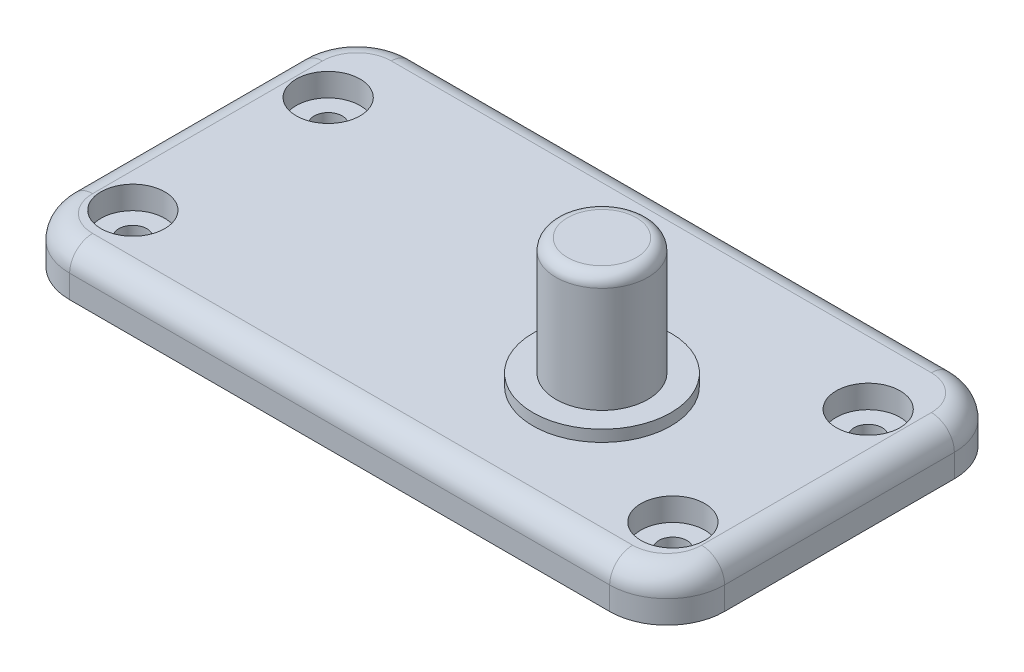
ISO-10303-21;
HEADER;
FILE_DESCRIPTION(('STEP AP214'),'2;1');
FILE_NAME('part.step','',(''),(''),'','','');
FILE_SCHEMA(('AUTOMOTIVE_DESIGN { 1 0 10303 214 1 1 1 1 }'));
ENDSEC;
DATA;
#1=APPLICATION_CONTEXT('core data for automotive mechanical design processes');
#2=APPLICATION_PROTOCOL_DEFINITION('international standard','automotive_design',2000,#1);
#3=PRODUCT_CONTEXT('',#1,'mechanical');
#4=PRODUCT('Part','Part','',(#3));
#5=PRODUCT_RELATED_PRODUCT_CATEGORY('part','',(#4));
#6=PRODUCT_DEFINITION_FORMATION('','',#4);
#7=PRODUCT_DEFINITION_CONTEXT('part definition',#1,'design');
#8=PRODUCT_DEFINITION('design','',#6,#7);
#9=PRODUCT_DEFINITION_SHAPE('','',#8);
#10=(LENGTH_UNIT() NAMED_UNIT(*) SI_UNIT(.MILLI.,.METRE.));
#11=(NAMED_UNIT(*) PLANE_ANGLE_UNIT() SI_UNIT($,.RADIAN.));
#12=(NAMED_UNIT(*) SI_UNIT($,.STERADIAN.) SOLID_ANGLE_UNIT());
#13=UNCERTAINTY_MEASURE_WITH_UNIT(LENGTH_MEASURE(1.E-05),#10,'distance_accuracy_value','');
#14=(GEOMETRIC_REPRESENTATION_CONTEXT(3) GLOBAL_UNCERTAINTY_ASSIGNED_CONTEXT((#13)) GLOBAL_UNIT_ASSIGNED_CONTEXT((#10,
#11,#12)) REPRESENTATION_CONTEXT('',''));
#15=CARTESIAN_POINT('',(0.,0.,0.));
#16=DIRECTION('',(0.,0.,1.));
#17=DIRECTION('',(1.,0.,0.));
#18=AXIS2_PLACEMENT_3D('',#15,#16,#17);
#19=CARTESIAN_POINT('',(-28.5,4.,15.));
#20=DIRECTION('',(1.,0.,0.));
#21=DIRECTION('',(0.,0.,-1.));
#22=AXIS2_PLACEMENT_3D('',#19,#20,#21);
#23=PLANE('',#22);
#24=DIRECTION('',(0.,-1.,0.));
#25=VECTOR('',#24,1.);
#26=CARTESIAN_POINT('',(-28.5,4.,10.));
#27=LINE('',#26,#25);
#28=CARTESIAN_POINT('',(-28.5,0.,10.));
#29=VERTEX_POINT('',#28);
#30=CARTESIAN_POINT('',(-28.5,2.,10.));
#31=VERTEX_POINT('',#30);
#32=EDGE_CURVE('E171',#29,#31,#27,.F.);
#33=ORIENTED_EDGE('',*,*,#32,.T.);
#34=DIRECTION('',(0.,0.,1.));
#35=VECTOR('',#34,1.);
#36=CARTESIAN_POINT('',(-28.5,2.,15.));
#37=LINE('',#36,#35);
#38=CARTESIAN_POINT('',(-28.5,2.,-10.));
#39=VERTEX_POINT('',#38);
#40=EDGE_CURVE('E200',#31,#39,#37,.F.);
#41=ORIENTED_EDGE('',*,*,#40,.T.);
#42=DIRECTION('',(0.,-1.,0.));
#43=VECTOR('',#42,1.);
#44=CARTESIAN_POINT('',(-28.5,4.,-10.));
#45=LINE('',#44,#43);
#46=CARTESIAN_POINT('',(-28.5,0.,-10.));
#47=VERTEX_POINT('',#46);
#48=EDGE_CURVE('E174',#39,#47,#45,.T.);
#49=ORIENTED_EDGE('',*,*,#48,.T.);
#50=DIRECTION('',(0.,0.,1.));
#51=VECTOR('',#50,1.);
#52=CARTESIAN_POINT('',(-28.5,0.,15.));
#53=LINE('',#52,#51);
#54=EDGE_CURVE('E157',#47,#29,#53,.T.);
#55=ORIENTED_EDGE('',*,*,#54,.T.);
#56=EDGE_LOOP('',(#33,#41,#49,#55));
#57=FACE_BOUND('',#56,.T.);
#58=ADVANCED_FACE('F34',(#57),#23,.F.);
#59=CARTESIAN_POINT('',(-28.5,4.,15.));
#60=DIRECTION('',(0.,0.,-1.));
#61=DIRECTION('',(-1.,0.,0.));
#62=AXIS2_PLACEMENT_3D('',#59,#60,#61);
#63=PLANE('',#62);
#64=DIRECTION('',(0.,-1.,0.));
#65=VECTOR('',#64,1.);
#66=CARTESIAN_POINT('',(23.5,4.,15.));
#67=LINE('',#66,#65);
#68=CARTESIAN_POINT('',(23.5,0.,15.));
#69=VERTEX_POINT('',#68);
#70=CARTESIAN_POINT('',(23.5,2.,15.));
#71=VERTEX_POINT('',#70);
#72=EDGE_CURVE('E168',#69,#71,#67,.F.);
#73=ORIENTED_EDGE('',*,*,#72,.T.);
#74=DIRECTION('',(1.,0.,0.));
#75=VECTOR('',#74,1.);
#76=CARTESIAN_POINT('',(-28.5,2.,15.));
#77=LINE('',#76,#75);
#78=CARTESIAN_POINT('',(-23.5,2.,15.));
#79=VERTEX_POINT('',#78);
#80=EDGE_CURVE('E196',#71,#79,#77,.F.);
#81=ORIENTED_EDGE('',*,*,#80,.T.);
#82=DIRECTION('',(0.,-1.,0.));
#83=VECTOR('',#82,1.);
#84=CARTESIAN_POINT('',(-23.5,4.,15.));
#85=LINE('',#84,#83);
#86=CARTESIAN_POINT('',(-23.5,0.,15.));
#87=VERTEX_POINT('',#86);
#88=EDGE_CURVE('E166',#79,#87,#85,.T.);
#89=ORIENTED_EDGE('',*,*,#88,.T.);
#90=DIRECTION('',(1.,0.,0.));
#91=VECTOR('',#90,1.);
#92=CARTESIAN_POINT('',(-28.5,0.,15.));
#93=LINE('',#92,#91);
#94=EDGE_CURVE('E151',#87,#69,#93,.T.);
#95=ORIENTED_EDGE('',*,*,#94,.T.);
#96=EDGE_LOOP('',(#73,#81,#89,#95));
#97=FACE_BOUND('',#96,.T.);
#98=ADVANCED_FACE('F246',(#97),#63,.F.);
#99=CARTESIAN_POINT('',(28.5,4.,15.));
#100=DIRECTION('',(-1.,0.,0.));
#101=DIRECTION('',(0.,0.,1.));
#102=AXIS2_PLACEMENT_3D('',#99,#100,#101);
#103=PLANE('',#102);
#104=DIRECTION('',(0.,-1.,0.));
#105=VECTOR('',#104,1.);
#106=CARTESIAN_POINT('',(28.5,4.,-10.));
#107=LINE('',#106,#105);
#108=CARTESIAN_POINT('',(28.5,0.,-10.));
#109=VERTEX_POINT('',#108);
#110=CARTESIAN_POINT('',(28.5,2.,-10.));
#111=VERTEX_POINT('',#110);
#112=EDGE_CURVE('E135',#109,#111,#107,.F.);
#113=ORIENTED_EDGE('',*,*,#112,.T.);
#114=DIRECTION('',(0.,0.,-1.));
#115=VECTOR('',#114,1.);
#116=CARTESIAN_POINT('',(28.5,2.,15.));
#117=LINE('',#116,#115);
#118=CARTESIAN_POINT('',(28.5,2.,10.));
#119=VERTEX_POINT('',#118);
#120=EDGE_CURVE('E206',#111,#119,#117,.F.);
#121=ORIENTED_EDGE('',*,*,#120,.T.);
#122=DIRECTION('',(0.,-1.,0.));
#123=VECTOR('',#122,1.);
#124=CARTESIAN_POINT('',(28.5,4.,10.));
#125=LINE('',#124,#123);
#126=CARTESIAN_POINT('',(28.5,0.,10.));
#127=VERTEX_POINT('',#126);
#128=EDGE_CURVE('E139',#119,#127,#125,.T.);
#129=ORIENTED_EDGE('',*,*,#128,.T.);
#130=DIRECTION('',(0.,0.,-1.));
#131=VECTOR('',#130,1.);
#132=CARTESIAN_POINT('',(28.5,0.,15.));
#133=LINE('',#132,#131);
#134=EDGE_CURVE('E147',#127,#109,#133,.T.);
#135=ORIENTED_EDGE('',*,*,#134,.T.);
#136=EDGE_LOOP('',(#113,#121,#129,#135));
#137=FACE_BOUND('',#136,.T.);
#138=ADVANCED_FACE('F252',(#137),#103,.F.);
#139=CARTESIAN_POINT('',(-28.5,4.,-15.));
#140=DIRECTION('',(0.,0.,1.));
#141=DIRECTION('',(1.,0.,0.));
#142=AXIS2_PLACEMENT_3D('',#139,#140,#141);
#143=PLANE('',#142);
#144=DIRECTION('',(0.,-1.,0.));
#145=VECTOR('',#144,1.);
#146=CARTESIAN_POINT('',(-23.5,4.,-15.));
#147=LINE('',#146,#145);
#148=CARTESIAN_POINT('',(-23.5,0.,-15.));
#149=VERTEX_POINT('',#148);
#150=CARTESIAN_POINT('',(-23.5,2.,-15.));
#151=VERTEX_POINT('',#150);
#152=EDGE_CURVE('E131',#149,#151,#147,.F.);
#153=ORIENTED_EDGE('',*,*,#152,.T.);
#154=DIRECTION('',(-1.,0.,0.));
#155=VECTOR('',#154,1.);
#156=CARTESIAN_POINT('',(-28.5,2.,-15.));
#157=LINE('',#156,#155);
#158=CARTESIAN_POINT('',(23.5,2.,-15.));
#159=VERTEX_POINT('',#158);
#160=EDGE_CURVE('E57',#151,#159,#157,.F.);
#161=ORIENTED_EDGE('',*,*,#160,.T.);
#162=DIRECTION('',(0.,-1.,0.));
#163=VECTOR('',#162,1.);
#164=CARTESIAN_POINT('',(23.5,4.,-15.));
#165=LINE('',#164,#163);
#166=CARTESIAN_POINT('',(23.5,0.,-15.));
#167=VERTEX_POINT('',#166);
#168=EDGE_CURVE('E123',#159,#167,#165,.T.);
#169=ORIENTED_EDGE('',*,*,#168,.T.);
#170=DIRECTION('',(-1.,0.,0.));
#171=VECTOR('',#170,1.);
#172=CARTESIAN_POINT('',(-28.5,0.,-15.));
#173=LINE('',#172,#171);
#174=EDGE_CURVE('E127',#167,#149,#173,.T.);
#175=ORIENTED_EDGE('',*,*,#174,.T.);
#176=EDGE_LOOP('',(#153,#161,#169,#175));
#177=FACE_BOUND('',#176,.T.);
#178=ADVANCED_FACE('F125',(#177),#143,.F.);
#179=CARTESIAN_POINT('',(0.,4.,0.));
#180=DIRECTION('',(0.,-1.,0.));
#181=DIRECTION('',(0.,0.,-1.));
#182=AXIS2_PLACEMENT_3D('',#179,#180,#181);
#183=PLANE('',#182);
#184=DIRECTION('',(1.,0.,0.));
#185=VECTOR('',#184,1.);
#186=CARTESIAN_POINT('',(0.,4.,13.));
#187=LINE('',#186,#185);
#188=CARTESIAN_POINT('',(-23.5,4.,13.));
#189=VERTEX_POINT('',#188);
#190=CARTESIAN_POINT('',(23.5,4.,13.));
#191=VERTEX_POINT('',#190);
#192=EDGE_CURVE('E188',#189,#191,#187,.T.);
#193=ORIENTED_EDGE('',*,*,#192,.T.);
#194=CARTESIAN_POINT('',(23.5,4.,10.));
#195=DIRECTION('',(0.,-1.,0.));
#196=DIRECTION('',(0.,0.,-1.));
#197=AXIS2_PLACEMENT_3D('',#194,#195,#196);
#198=CIRCLE('',#197,3.);
#199=CARTESIAN_POINT('',(26.5,4.,10.));
#200=VERTEX_POINT('',#199);
#201=EDGE_CURVE('E190',#191,#200,#198,.F.);
#202=ORIENTED_EDGE('',*,*,#201,.T.);
#203=DIRECTION('',(0.,0.,-1.));
#204=VECTOR('',#203,1.);
#205=CARTESIAN_POINT('',(26.5,4.,0.));
#206=LINE('',#205,#204);
#207=CARTESIAN_POINT('',(26.5,4.,-10.));
#208=VERTEX_POINT('',#207);
#209=EDGE_CURVE('E176',#200,#208,#206,.T.);
#210=ORIENTED_EDGE('',*,*,#209,.T.);
#211=CARTESIAN_POINT('',(23.5,4.,-10.));
#212=DIRECTION('',(0.,-1.,0.));
#213=DIRECTION('',(0.,0.,-1.));
#214=AXIS2_PLACEMENT_3D('',#211,#212,#213);
#215=CIRCLE('',#214,3.);
#216=CARTESIAN_POINT('',(23.5,4.,-13.));
#217=VERTEX_POINT('',#216);
#218=EDGE_CURVE('E178',#208,#217,#215,.F.);
#219=ORIENTED_EDGE('',*,*,#218,.T.);
#220=DIRECTION('',(-1.,0.,0.));
#221=VECTOR('',#220,1.);
#222=CARTESIAN_POINT('',(0.,4.,-13.));
#223=LINE('',#222,#221);
#224=CARTESIAN_POINT('',(-23.5,4.,-13.));
#225=VERTEX_POINT('',#224);
#226=EDGE_CURVE('E180',#217,#225,#223,.T.);
#227=ORIENTED_EDGE('',*,*,#226,.T.);
#228=CARTESIAN_POINT('',(-23.5,4.,-10.));
#229=DIRECTION('',(0.,-1.,0.));
#230=DIRECTION('',(0.,0.,-1.));
#231=AXIS2_PLACEMENT_3D('',#228,#229,#230);
#232=CIRCLE('',#231,3.);
#233=CARTESIAN_POINT('',(-26.5,4.,-10.));
#234=VERTEX_POINT('',#233);
#235=EDGE_CURVE('E182',#225,#234,#232,.F.);
#236=ORIENTED_EDGE('',*,*,#235,.T.);
#237=DIRECTION('',(0.,0.,1.));
#238=VECTOR('',#237,1.);
#239=CARTESIAN_POINT('',(-26.5,4.,0.));
#240=LINE('',#239,#238);
#241=CARTESIAN_POINT('',(-26.5,4.,10.));
#242=VERTEX_POINT('',#241);
#243=EDGE_CURVE('E184',#234,#242,#240,.T.);
#244=ORIENTED_EDGE('',*,*,#243,.T.);
#245=CARTESIAN_POINT('',(-23.5,4.,10.));
#246=DIRECTION('',(0.,-1.,0.));
#247=DIRECTION('',(0.,0.,-1.));
#248=AXIS2_PLACEMENT_3D('',#245,#246,#247);
#249=CIRCLE('',#248,3.);
#250=EDGE_CURVE('E186',#242,#189,#249,.F.);
#251=ORIENTED_EDGE('',*,*,#250,.T.);
#252=EDGE_LOOP('',(#193,#202,#210,#219,#227,#236,#244,#251));
#253=FACE_BOUND('',#252,.T.);
#254=CARTESIAN_POINT('',(-23.5,4.,-7.5));
#255=DIRECTION('',(0.,1.,0.));
#256=DIRECTION('',(0.,0.,1.));
#257=AXIS2_PLACEMENT_3D('',#254,#255,#256);
#258=CIRCLE('',#257,2.77875999999999);
#259=CARTESIAN_POINT('',(-23.5,4.,-4.72124000000001));
#260=VERTEX_POINT('',#259);
#261=EDGE_CURVE('E229',#260,#260,#258,.T.);
#262=ORIENTED_EDGE('',*,*,#261,.F.);
#263=EDGE_LOOP('',(#262));
#264=FACE_BOUND('',#263,.T.);
#265=CARTESIAN_POINT('',(-23.5,4.,9.5));
#266=DIRECTION('',(0.,1.,0.));
#267=DIRECTION('',(0.,0.,1.));
#268=AXIS2_PLACEMENT_3D('',#265,#266,#267);
#269=CIRCLE('',#268,2.77875999999999);
#270=CARTESIAN_POINT('',(-23.5,4.,12.27876));
#271=VERTEX_POINT('',#270);
#272=EDGE_CURVE('E368',#271,#271,#269,.T.);
#273=ORIENTED_EDGE('',*,*,#272,.F.);
#274=EDGE_LOOP('',(#273));
#275=FACE_BOUND('',#274,.T.);
#276=CARTESIAN_POINT('',(23.5,4.,9.5));
#277=DIRECTION('',(0.,1.,0.));
#278=DIRECTION('',(0.,0.,1.));
#279=AXIS2_PLACEMENT_3D('',#276,#277,#278);
#280=CIRCLE('',#279,2.77875999999999);
#281=CARTESIAN_POINT('',(23.5,4.,12.27876));
#282=VERTEX_POINT('',#281);
#283=EDGE_CURVE('E356',#282,#282,#280,.T.);
#284=ORIENTED_EDGE('',*,*,#283,.F.);
#285=EDGE_LOOP('',(#284));
#286=FACE_BOUND('',#285,.T.);
#287=CARTESIAN_POINT('',(23.5,4.,-7.5));
#288=DIRECTION('',(0.,1.,0.));
#289=DIRECTION('',(0.,0.,1.));
#290=AXIS2_PLACEMENT_3D('',#287,#288,#289);
#291=CIRCLE('',#290,2.77875999999999);
#292=CARTESIAN_POINT('',(23.5,4.,-4.72124000000001));
#293=VERTEX_POINT('',#292);
#294=EDGE_CURVE('E344',#293,#293,#291,.T.);
#295=ORIENTED_EDGE('',*,*,#294,.F.);
#296=EDGE_LOOP('',(#295));
#297=FACE_BOUND('',#296,.T.);
#298=CARTESIAN_POINT('',(10.18,4.,2.35));
#299=DIRECTION('',(0.,-1.,0.));
#300=DIRECTION('',(0.,0.,-1.));
#301=AXIS2_PLACEMENT_3D('',#298,#299,#300);
#302=CIRCLE('',#301,6.);
#303=CARTESIAN_POINT('',(10.18,4.,-3.65));
#304=VERTEX_POINT('',#303);
#305=EDGE_CURVE('E146',#304,#304,#302,.F.);
#306=ORIENTED_EDGE('',*,*,#305,.F.);
#307=EDGE_LOOP('',(#306));
#308=FACE_BOUND('',#307,.T.);
#309=ADVANCED_FACE('F384',(#253,#264,#275,#286,#297,#308),#183,.F.);
#310=CARTESIAN_POINT('',(0.,0.,0.));
#311=DIRECTION('',(0.,-1.,0.));
#312=DIRECTION('',(0.,0.,-1.));
#313=AXIS2_PLACEMENT_3D('',#310,#311,#312);
#314=PLANE('',#313);
#315=CARTESIAN_POINT('',(-23.5,0.,-7.5));
#316=DIRECTION('',(0.,1.,0.));
#317=DIRECTION('',(0.,0.,1.));
#318=AXIS2_PLACEMENT_3D('',#315,#316,#317);
#319=CIRCLE('',#318,1.2192);
#320=CARTESIAN_POINT('',(-23.5,0.,-6.2808));
#321=VERTEX_POINT('',#320);
#322=EDGE_CURVE('E371',#321,#321,#319,.T.);
#323=ORIENTED_EDGE('',*,*,#322,.T.);
#324=EDGE_LOOP('',(#323));
#325=FACE_BOUND('',#324,.T.);
#326=CARTESIAN_POINT('',(-23.5,0.,9.5));
#327=DIRECTION('',(0.,1.,0.));
#328=DIRECTION('',(0.,0.,1.));
#329=AXIS2_PLACEMENT_3D('',#326,#327,#328);
#330=CIRCLE('',#329,1.2192);
#331=CARTESIAN_POINT('',(-23.5,0.,10.7192));
#332=VERTEX_POINT('',#331);
#333=EDGE_CURVE('E359',#332,#332,#330,.T.);
#334=ORIENTED_EDGE('',*,*,#333,.T.);
#335=EDGE_LOOP('',(#334));
#336=FACE_BOUND('',#335,.T.);
#337=CARTESIAN_POINT('',(23.5,0.,9.5));
#338=DIRECTION('',(0.,1.,0.));
#339=DIRECTION('',(0.,0.,1.));
#340=AXIS2_PLACEMENT_3D('',#337,#338,#339);
#341=CIRCLE('',#340,1.2192);
#342=CARTESIAN_POINT('',(23.5,0.,10.7192));
#343=VERTEX_POINT('',#342);
#344=EDGE_CURVE('E347',#343,#343,#341,.T.);
#345=ORIENTED_EDGE('',*,*,#344,.T.);
#346=EDGE_LOOP('',(#345));
#347=FACE_BOUND('',#346,.T.);
#348=CARTESIAN_POINT('',(23.5,0.,-7.5));
#349=DIRECTION('',(0.,1.,0.));
#350=DIRECTION('',(0.,0.,1.));
#351=AXIS2_PLACEMENT_3D('',#348,#349,#350);
#352=CIRCLE('',#351,1.2192);
#353=CARTESIAN_POINT('',(23.5,0.,-6.2808));
#354=VERTEX_POINT('',#353);
#355=EDGE_CURVE('E335',#354,#354,#352,.T.);
#356=ORIENTED_EDGE('',*,*,#355,.T.);
#357=EDGE_LOOP('',(#356));
#358=FACE_BOUND('',#357,.T.);
#359=ORIENTED_EDGE('',*,*,#174,.F.);
#360=CARTESIAN_POINT('',(23.5,0.,-10.));
#361=DIRECTION('',(0.,-1.,0.));
#362=DIRECTION('',(0.,0.,-1.));
#363=AXIS2_PLACEMENT_3D('',#360,#361,#362);
#364=CIRCLE('',#363,5.);
#365=EDGE_CURVE('E133',#167,#109,#364,.T.);
#366=ORIENTED_EDGE('',*,*,#365,.T.);
#367=ORIENTED_EDGE('',*,*,#134,.F.);
#368=CARTESIAN_POINT('',(23.5,0.,10.));
#369=DIRECTION('',(0.,-1.,0.));
#370=DIRECTION('',(0.,0.,-1.));
#371=AXIS2_PLACEMENT_3D('',#368,#369,#370);
#372=CIRCLE('',#371,5.);
#373=EDGE_CURVE('E140',#127,#69,#372,.T.);
#374=ORIENTED_EDGE('',*,*,#373,.T.);
#375=ORIENTED_EDGE('',*,*,#94,.F.);
#376=CARTESIAN_POINT('',(-23.5,0.,10.));
#377=DIRECTION('',(0.,-1.,0.));
#378=DIRECTION('',(0.,0.,-1.));
#379=AXIS2_PLACEMENT_3D('',#376,#377,#378);
#380=CIRCLE('',#379,5.);
#381=EDGE_CURVE('E130',#87,#29,#380,.T.);
#382=ORIENTED_EDGE('',*,*,#381,.T.);
#383=ORIENTED_EDGE('',*,*,#54,.F.);
#384=CARTESIAN_POINT('',(-23.5,0.,-10.));
#385=DIRECTION('',(0.,-1.,0.));
#386=DIRECTION('',(0.,0.,-1.));
#387=AXIS2_PLACEMENT_3D('',#384,#385,#386);
#388=CIRCLE('',#387,5.);
#389=EDGE_CURVE('E145',#47,#149,#388,.T.);
#390=ORIENTED_EDGE('',*,*,#389,.T.);
#391=EDGE_LOOP('',(#359,#366,#367,#374,#375,#382,#383,#390));
#392=FACE_BOUND('',#391,.T.);
#393=ADVANCED_FACE('F142',(#325,#336,#347,#358,#392),#314,.T.);
#394=CARTESIAN_POINT('',(10.18,5.,2.35));
#395=DIRECTION('',(0.,-1.,0.));
#396=DIRECTION('',(0.,0.,-1.));
#397=AXIS2_PLACEMENT_3D('',#394,#395,#396);
#398=CYLINDRICAL_SURFACE('',#397,6.);
#399=CARTESIAN_POINT('',(10.18,5.,2.35));
#400=DIRECTION('',(0.,1.,0.));
#401=DIRECTION('',(0.,0.,1.));
#402=AXIS2_PLACEMENT_3D('',#399,#400,#401);
#403=CIRCLE('',#402,6.);
#404=CARTESIAN_POINT('',(10.18,5.,8.35));
#405=VERTEX_POINT('',#404);
#406=EDGE_CURVE('E158',#405,#405,#403,.T.);
#407=ORIENTED_EDGE('',*,*,#406,.F.);
#408=EDGE_LOOP('',(#407));
#409=FACE_BOUND('',#408,.T.);
#410=ORIENTED_EDGE('',*,*,#305,.T.);
#411=EDGE_LOOP('',(#410));
#412=FACE_BOUND('',#411,.T.);
#413=ADVANCED_FACE('F397',(#409,#412),#398,.T.);
#414=CARTESIAN_POINT('',(10.18,5.,2.35));
#415=DIRECTION('',(0.,1.,0.));
#416=DIRECTION('',(0.,0.,1.));
#417=AXIS2_PLACEMENT_3D('',#414,#415,#416);
#418=PLANE('',#417);
#419=CARTESIAN_POINT('',(10.18,5.,2.35));
#420=DIRECTION('',(0.,1.,0.));
#421=DIRECTION('',(0.,0.,1.));
#422=AXIS2_PLACEMENT_3D('',#419,#420,#421);
#423=CIRCLE('',#422,3.99999999999999);
#424=CARTESIAN_POINT('',(10.18,5.,6.34999999999999));
#425=VERTEX_POINT('',#424);
#426=EDGE_CURVE('E155',#425,#425,#423,.T.);
#427=ORIENTED_EDGE('',*,*,#426,.F.);
#428=EDGE_LOOP('',(#427));
#429=FACE_BOUND('',#428,.T.);
#430=ORIENTED_EDGE('',*,*,#406,.T.);
#431=EDGE_LOOP('',(#430));
#432=FACE_BOUND('',#431,.T.);
#433=ADVANCED_FACE('F399',(#429,#432),#418,.T.);
#434=CARTESIAN_POINT('',(10.18,15.2,2.35));
#435=DIRECTION('',(0.,1.,0.));
#436=DIRECTION('',(0.,0.,1.));
#437=AXIS2_PLACEMENT_3D('',#434,#435,#436);
#438=PLANE('',#437);
#439=CARTESIAN_POINT('',(10.18,15.2,2.35));
#440=DIRECTION('',(0.,1.,0.));
#441=DIRECTION('',(0.,0.,1.));
#442=AXIS2_PLACEMENT_3D('',#439,#440,#441);
#443=CIRCLE('',#442,2.99999999999999);
#444=CARTESIAN_POINT('',(10.18,15.2,5.35));
#445=VERTEX_POINT('',#444);
#446=EDGE_CURVE('E42',#445,#445,#443,.T.);
#447=ORIENTED_EDGE('',*,*,#446,.T.);
#448=EDGE_LOOP('',(#447));
#449=FACE_BOUND('',#448,.T.);
#450=ADVANCED_FACE('F233',(#449),#438,.T.);
#451=CARTESIAN_POINT('',(10.18,15.2,2.35));
#452=DIRECTION('',(0.,-1.,0.));
#453=DIRECTION('',(0.,0.,-1.));
#454=AXIS2_PLACEMENT_3D('',#451,#452,#453);
#455=CYLINDRICAL_SURFACE('',#454,3.99999999999999);
#456=CARTESIAN_POINT('',(10.18,14.2,2.35));
#457=DIRECTION('',(0.,1.,0.));
#458=DIRECTION('',(0.,0.,1.));
#459=AXIS2_PLACEMENT_3D('',#456,#457,#458);
#460=CIRCLE('',#459,3.99999999999999);
#461=CARTESIAN_POINT('',(10.18,14.2,6.34999999999999));
#462=VERTEX_POINT('',#461);
#463=EDGE_CURVE('E11',#462,#462,#460,.F.);
#464=ORIENTED_EDGE('',*,*,#463,.T.);
#465=EDGE_LOOP('',(#464));
#466=FACE_BOUND('',#465,.T.);
#467=ORIENTED_EDGE('',*,*,#426,.T.);
#468=EDGE_LOOP('',(#467));
#469=FACE_BOUND('',#468,.T.);
#470=ADVANCED_FACE('F415',(#466,#469),#455,.T.);
#471=CARTESIAN_POINT('',(23.5,4.,-7.5));
#472=DIRECTION('',(0.,1.,0.));
#473=DIRECTION('',(0.,0.,1.));
#474=AXIS2_PLACEMENT_3D('',#471,#472,#473);
#475=CYLINDRICAL_SURFACE('',#474,1.2192);
#476=ORIENTED_EDGE('',*,*,#355,.F.);
#477=EDGE_LOOP('',(#476));
#478=FACE_BOUND('',#477,.T.);
#479=CARTESIAN_POINT('',(23.5,1.999999936,-7.5));
#480=DIRECTION('',(0.,1.,0.));
#481=DIRECTION('',(0.,0.,1.));
#482=AXIS2_PLACEMENT_3D('',#479,#480,#481);
#483=CIRCLE('',#482,1.2192);
#484=CARTESIAN_POINT('',(23.5,1.999999936,-6.2808));
#485=VERTEX_POINT('',#484);
#486=EDGE_CURVE('E338',#485,#485,#483,.T.);
#487=ORIENTED_EDGE('',*,*,#486,.T.);
#488=EDGE_LOOP('',(#487));
#489=FACE_BOUND('',#488,.T.);
#490=ADVANCED_FACE('F417',(#478,#489),#475,.F.);
#491=CARTESIAN_POINT('',(24.7192,1.999999936,-7.5));
#492=DIRECTION('',(0.,-1.,0.));
#493=DIRECTION('',(0.,0.,-1.));
#494=AXIS2_PLACEMENT_3D('',#491,#492,#493);
#495=PLANE('',#494);
#496=ORIENTED_EDGE('',*,*,#486,.F.);
#497=EDGE_LOOP('',(#496));
#498=FACE_BOUND('',#497,.T.);
#499=CARTESIAN_POINT('',(23.5,1.999999936,-7.5));
#500=DIRECTION('',(0.,1.,0.));
#501=DIRECTION('',(0.,0.,1.));
#502=AXIS2_PLACEMENT_3D('',#499,#500,#501);
#503=CIRCLE('',#502,2.77876);
#504=CARTESIAN_POINT('',(23.5,1.999999936,-4.72124));
#505=VERTEX_POINT('',#504);
#506=EDGE_CURVE('E341',#505,#505,#503,.T.);
#507=ORIENTED_EDGE('',*,*,#506,.T.);
#508=EDGE_LOOP('',(#507));
#509=FACE_BOUND('',#508,.T.);
#510=ADVANCED_FACE('F554',(#498,#509),#495,.F.);
#511=CARTESIAN_POINT('',(23.5,4.,-7.5));
#512=DIRECTION('',(0.,1.,0.));
#513=DIRECTION('',(0.,0.,1.));
#514=AXIS2_PLACEMENT_3D('',#511,#512,#513);
#515=CYLINDRICAL_SURFACE('',#514,2.77876);
#516=ORIENTED_EDGE('',*,*,#506,.F.);
#517=EDGE_LOOP('',(#516));
#518=FACE_BOUND('',#517,.T.);
#519=ORIENTED_EDGE('',*,*,#294,.T.);
#520=EDGE_LOOP('',(#519));
#521=FACE_BOUND('',#520,.T.);
#522=ADVANCED_FACE('F544',(#518,#521),#515,.F.);
#523=CARTESIAN_POINT('',(23.5,4.,9.5));
#524=DIRECTION('',(0.,1.,0.));
#525=DIRECTION('',(0.,0.,1.));
#526=AXIS2_PLACEMENT_3D('',#523,#524,#525);
#527=CYLINDRICAL_SURFACE('',#526,1.2192);
#528=ORIENTED_EDGE('',*,*,#344,.F.);
#529=EDGE_LOOP('',(#528));
#530=FACE_BOUND('',#529,.T.);
#531=CARTESIAN_POINT('',(23.5,1.999999936,9.5));
#532=DIRECTION('',(0.,1.,0.));
#533=DIRECTION('',(0.,0.,1.));
#534=AXIS2_PLACEMENT_3D('',#531,#532,#533);
#535=CIRCLE('',#534,1.2192);
#536=CARTESIAN_POINT('',(23.5,1.999999936,10.7192));
#537=VERTEX_POINT('',#536);
#538=EDGE_CURVE('E350',#537,#537,#535,.T.);
#539=ORIENTED_EDGE('',*,*,#538,.T.);
#540=EDGE_LOOP('',(#539));
#541=FACE_BOUND('',#540,.T.);
#542=ADVANCED_FACE('F534',(#530,#541),#527,.F.);
#543=CARTESIAN_POINT('',(24.7192,1.999999936,9.5));
#544=DIRECTION('',(0.,-1.,0.));
#545=DIRECTION('',(0.,0.,-1.));
#546=AXIS2_PLACEMENT_3D('',#543,#544,#545);
#547=PLANE('',#546);
#548=ORIENTED_EDGE('',*,*,#538,.F.);
#549=EDGE_LOOP('',(#548));
#550=FACE_BOUND('',#549,.T.);
#551=CARTESIAN_POINT('',(23.5,1.999999936,9.5));
#552=DIRECTION('',(0.,1.,0.));
#553=DIRECTION('',(0.,0.,1.));
#554=AXIS2_PLACEMENT_3D('',#551,#552,#553);
#555=CIRCLE('',#554,2.77876);
#556=CARTESIAN_POINT('',(23.5,1.999999936,12.27876));
#557=VERTEX_POINT('',#556);
#558=EDGE_CURVE('E353',#557,#557,#555,.T.);
#559=ORIENTED_EDGE('',*,*,#558,.T.);
#560=EDGE_LOOP('',(#559));
#561=FACE_BOUND('',#560,.T.);
#562=ADVANCED_FACE('F524',(#550,#561),#547,.F.);
#563=CARTESIAN_POINT('',(23.5,4.,9.5));
#564=DIRECTION('',(0.,1.,0.));
#565=DIRECTION('',(0.,0.,1.));
#566=AXIS2_PLACEMENT_3D('',#563,#564,#565);
#567=CYLINDRICAL_SURFACE('',#566,2.77876);
#568=ORIENTED_EDGE('',*,*,#558,.F.);
#569=EDGE_LOOP('',(#568));
#570=FACE_BOUND('',#569,.T.);
#571=ORIENTED_EDGE('',*,*,#283,.T.);
#572=EDGE_LOOP('',(#571));
#573=FACE_BOUND('',#572,.T.);
#574=ADVANCED_FACE('F514',(#570,#573),#567,.F.);
#575=CARTESIAN_POINT('',(-23.5,4.,9.5));
#576=DIRECTION('',(0.,1.,0.));
#577=DIRECTION('',(0.,0.,1.));
#578=AXIS2_PLACEMENT_3D('',#575,#576,#577);
#579=CYLINDRICAL_SURFACE('',#578,1.2192);
#580=ORIENTED_EDGE('',*,*,#333,.F.);
#581=EDGE_LOOP('',(#580));
#582=FACE_BOUND('',#581,.T.);
#583=CARTESIAN_POINT('',(-23.5,1.999999936,9.5));
#584=DIRECTION('',(0.,1.,0.));
#585=DIRECTION('',(0.,0.,1.));
#586=AXIS2_PLACEMENT_3D('',#583,#584,#585);
#587=CIRCLE('',#586,1.2192);
#588=CARTESIAN_POINT('',(-23.5,1.999999936,10.7192));
#589=VERTEX_POINT('',#588);
#590=EDGE_CURVE('E362',#589,#589,#587,.T.);
#591=ORIENTED_EDGE('',*,*,#590,.T.);
#592=EDGE_LOOP('',(#591));
#593=FACE_BOUND('',#592,.T.);
#594=ADVANCED_FACE('F504',(#582,#593),#579,.F.);
#595=CARTESIAN_POINT('',(-22.2808,1.999999936,9.5));
#596=DIRECTION('',(0.,-1.,0.));
#597=DIRECTION('',(0.,0.,-1.));
#598=AXIS2_PLACEMENT_3D('',#595,#596,#597);
#599=PLANE('',#598);
#600=ORIENTED_EDGE('',*,*,#590,.F.);
#601=EDGE_LOOP('',(#600));
#602=FACE_BOUND('',#601,.T.);
#603=CARTESIAN_POINT('',(-23.5,1.999999936,9.5));
#604=DIRECTION('',(0.,1.,0.));
#605=DIRECTION('',(0.,0.,1.));
#606=AXIS2_PLACEMENT_3D('',#603,#604,#605);
#607=CIRCLE('',#606,2.77876);
#608=CARTESIAN_POINT('',(-23.5,1.999999936,12.27876));
#609=VERTEX_POINT('',#608);
#610=EDGE_CURVE('E365',#609,#609,#607,.T.);
#611=ORIENTED_EDGE('',*,*,#610,.T.);
#612=EDGE_LOOP('',(#611));
#613=FACE_BOUND('',#612,.T.);
#614=ADVANCED_FACE('F494',(#602,#613),#599,.F.);
#615=CARTESIAN_POINT('',(-23.5,4.,9.5));
#616=DIRECTION('',(0.,1.,0.));
#617=DIRECTION('',(0.,0.,1.));
#618=AXIS2_PLACEMENT_3D('',#615,#616,#617);
#619=CYLINDRICAL_SURFACE('',#618,2.77876);
#620=ORIENTED_EDGE('',*,*,#610,.F.);
#621=EDGE_LOOP('',(#620));
#622=FACE_BOUND('',#621,.T.);
#623=ORIENTED_EDGE('',*,*,#272,.T.);
#624=EDGE_LOOP('',(#623));
#625=FACE_BOUND('',#624,.T.);
#626=ADVANCED_FACE('F484',(#622,#625),#619,.F.);
#627=CARTESIAN_POINT('',(-23.5,4.,-7.5));
#628=DIRECTION('',(0.,1.,0.));
#629=DIRECTION('',(0.,0.,1.));
#630=AXIS2_PLACEMENT_3D('',#627,#628,#629);
#631=CYLINDRICAL_SURFACE('',#630,1.2192);
#632=ORIENTED_EDGE('',*,*,#322,.F.);
#633=EDGE_LOOP('',(#632));
#634=FACE_BOUND('',#633,.T.);
#635=CARTESIAN_POINT('',(-23.5,1.999999936,-7.5));
#636=DIRECTION('',(0.,1.,0.));
#637=DIRECTION('',(0.,0.,1.));
#638=AXIS2_PLACEMENT_3D('',#635,#636,#637);
#639=CIRCLE('',#638,1.2192);
#640=CARTESIAN_POINT('',(-23.5,1.999999936,-6.2808));
#641=VERTEX_POINT('',#640);
#642=EDGE_CURVE('E374',#641,#641,#639,.T.);
#643=ORIENTED_EDGE('',*,*,#642,.T.);
#644=EDGE_LOOP('',(#643));
#645=FACE_BOUND('',#644,.T.);
#646=ADVANCED_FACE('F474',(#634,#645),#631,.F.);
#647=CARTESIAN_POINT('',(-22.2808,1.999999936,-7.5));
#648=DIRECTION('',(0.,-1.,0.));
#649=DIRECTION('',(0.,0.,-1.));
#650=AXIS2_PLACEMENT_3D('',#647,#648,#649);
#651=PLANE('',#650);
#652=ORIENTED_EDGE('',*,*,#642,.F.);
#653=EDGE_LOOP('',(#652));
#654=FACE_BOUND('',#653,.T.);
#655=CARTESIAN_POINT('',(-23.5,1.999999936,-7.5));
#656=DIRECTION('',(0.,1.,0.));
#657=DIRECTION('',(0.,0.,1.));
#658=AXIS2_PLACEMENT_3D('',#655,#656,#657);
#659=CIRCLE('',#658,2.77876);
#660=CARTESIAN_POINT('',(-23.5,1.999999936,-4.72124));
#661=VERTEX_POINT('',#660);
#662=EDGE_CURVE('E377',#661,#661,#659,.T.);
#663=ORIENTED_EDGE('',*,*,#662,.T.);
#664=EDGE_LOOP('',(#663));
#665=FACE_BOUND('',#664,.T.);
#666=ADVANCED_FACE('F463',(#654,#665),#651,.F.);
#667=CARTESIAN_POINT('',(-23.5,4.,-7.5));
#668=DIRECTION('',(0.,1.,0.));
#669=DIRECTION('',(0.,0.,1.));
#670=AXIS2_PLACEMENT_3D('',#667,#668,#669);
#671=CYLINDRICAL_SURFACE('',#670,2.77876);
#672=ORIENTED_EDGE('',*,*,#662,.F.);
#673=EDGE_LOOP('',(#672));
#674=FACE_BOUND('',#673,.T.);
#675=ORIENTED_EDGE('',*,*,#261,.T.);
#676=EDGE_LOOP('',(#675));
#677=FACE_BOUND('',#676,.T.);
#678=ADVANCED_FACE('F260',(#674,#677),#671,.F.);
#679=CARTESIAN_POINT('',(23.5,4.,-10.));
#680=DIRECTION('',(0.,-1.,0.));
#681=DIRECTION('',(0.,0.,-1.));
#682=AXIS2_PLACEMENT_3D('',#679,#680,#681);
#683=CYLINDRICAL_SURFACE('',#682,5.);
#684=ORIENTED_EDGE('',*,*,#168,.F.);
#685=CARTESIAN_POINT('',(23.5,2.,-10.));
#686=DIRECTION('',(0.,-1.,0.));
#687=DIRECTION('',(0.,0.,-1.));
#688=AXIS2_PLACEMENT_3D('',#685,#686,#687);
#689=CIRCLE('',#688,5.);
#690=EDGE_CURVE('E49',#159,#111,#689,.T.);
#691=ORIENTED_EDGE('',*,*,#690,.T.);
#692=ORIENTED_EDGE('',*,*,#112,.F.);
#693=ORIENTED_EDGE('',*,*,#365,.F.);
#694=EDGE_LOOP('',(#684,#691,#692,#693));
#695=FACE_BOUND('',#694,.T.);
#696=ADVANCED_FACE('F134',(#695),#683,.T.);
#697=CARTESIAN_POINT('',(23.5,4.,10.));
#698=DIRECTION('',(0.,-1.,0.));
#699=DIRECTION('',(0.,0.,-1.));
#700=AXIS2_PLACEMENT_3D('',#697,#698,#699);
#701=CYLINDRICAL_SURFACE('',#700,5.);
#702=ORIENTED_EDGE('',*,*,#128,.F.);
#703=CARTESIAN_POINT('',(23.5,2.,10.));
#704=DIRECTION('',(0.,-1.,0.));
#705=DIRECTION('',(0.,0.,-1.));
#706=AXIS2_PLACEMENT_3D('',#703,#704,#705);
#707=CIRCLE('',#706,5.);
#708=EDGE_CURVE('E193',#119,#71,#707,.T.);
#709=ORIENTED_EDGE('',*,*,#708,.T.);
#710=ORIENTED_EDGE('',*,*,#72,.F.);
#711=ORIENTED_EDGE('',*,*,#373,.F.);
#712=EDGE_LOOP('',(#702,#709,#710,#711));
#713=FACE_BOUND('',#712,.T.);
#714=ADVANCED_FACE('F259',(#713),#701,.T.);
#715=CARTESIAN_POINT('',(-23.5,4.,-10.));
#716=DIRECTION('',(0.,-1.,0.));
#717=DIRECTION('',(0.,0.,-1.));
#718=AXIS2_PLACEMENT_3D('',#715,#716,#717);
#719=CYLINDRICAL_SURFACE('',#718,5.);
#720=ORIENTED_EDGE('',*,*,#48,.F.);
#721=CARTESIAN_POINT('',(-23.5,2.,-10.));
#722=DIRECTION('',(0.,-1.,0.));
#723=DIRECTION('',(0.,0.,-1.));
#724=AXIS2_PLACEMENT_3D('',#721,#722,#723);
#725=CIRCLE('',#724,5.);
#726=EDGE_CURVE('E202',#39,#151,#725,.T.);
#727=ORIENTED_EDGE('',*,*,#726,.T.);
#728=ORIENTED_EDGE('',*,*,#152,.F.);
#729=ORIENTED_EDGE('',*,*,#389,.F.);
#730=EDGE_LOOP('',(#720,#727,#728,#729));
#731=FACE_BOUND('',#730,.T.);
#732=ADVANCED_FACE('F263',(#731),#719,.T.);
#733=CARTESIAN_POINT('',(-23.5,4.,10.));
#734=DIRECTION('',(0.,-1.,0.));
#735=DIRECTION('',(0.,0.,-1.));
#736=AXIS2_PLACEMENT_3D('',#733,#734,#735);
#737=CYLINDRICAL_SURFACE('',#736,5.);
#738=ORIENTED_EDGE('',*,*,#88,.F.);
#739=CARTESIAN_POINT('',(-23.5,2.,10.));
#740=DIRECTION('',(0.,-1.,0.));
#741=DIRECTION('',(0.,0.,-1.));
#742=AXIS2_PLACEMENT_3D('',#739,#740,#741);
#743=CIRCLE('',#742,5.);
#744=EDGE_CURVE('E198',#79,#31,#743,.T.);
#745=ORIENTED_EDGE('',*,*,#744,.T.);
#746=ORIENTED_EDGE('',*,*,#32,.F.);
#747=ORIENTED_EDGE('',*,*,#381,.F.);
#748=EDGE_LOOP('',(#738,#745,#746,#747));
#749=FACE_BOUND('',#748,.T.);
#750=ADVANCED_FACE('F267',(#749),#737,.T.);
#751=CARTESIAN_POINT('',(-23.5,2.,-10.));
#752=DIRECTION('',(0.,-1.,0.));
#753=DIRECTION('',(0.,0.,-1.));
#754=AXIS2_PLACEMENT_3D('',#751,#752,#753);
#755=TOROIDAL_SURFACE('',#754,3.,2.);
#756=CARTESIAN_POINT('',(-23.5,2.,-13.));
#757=DIRECTION('',(1.,0.,0.));
#758=DIRECTION('',(0.,0.,-1.));
#759=AXIS2_PLACEMENT_3D('',#756,#757,#758);
#760=CIRCLE('',#759,2.);
#761=EDGE_CURVE('E224',#151,#225,#760,.T.);
#762=ORIENTED_EDGE('',*,*,#761,.F.);
#763=ORIENTED_EDGE('',*,*,#726,.F.);
#764=CARTESIAN_POINT('',(-26.5,2.,-10.));
#765=DIRECTION('',(0.,0.,1.));
#766=DIRECTION('',(1.,0.,0.));
#767=AXIS2_PLACEMENT_3D('',#764,#765,#766);
#768=CIRCLE('',#767,2.);
#769=EDGE_CURVE('E227',#234,#39,#768,.T.);
#770=ORIENTED_EDGE('',*,*,#769,.F.);
#771=ORIENTED_EDGE('',*,*,#235,.F.);
#772=EDGE_LOOP('',(#762,#763,#770,#771));
#773=FACE_BOUND('',#772,.T.);
#774=ADVANCED_FACE('F270',(#773),#755,.T.);
#775=CARTESIAN_POINT('',(-26.5,2.,0.));
#776=DIRECTION('',(0.,0.,1.));
#777=DIRECTION('',(1.,0.,0.));
#778=AXIS2_PLACEMENT_3D('',#775,#776,#777);
#779=CYLINDRICAL_SURFACE('',#778,2.);
#780=ORIENTED_EDGE('',*,*,#769,.T.);
#781=ORIENTED_EDGE('',*,*,#40,.F.);
#782=CARTESIAN_POINT('',(-26.5,2.,10.));
#783=DIRECTION('',(0.,0.,1.));
#784=DIRECTION('',(1.,0.,0.));
#785=AXIS2_PLACEMENT_3D('',#782,#783,#784);
#786=CIRCLE('',#785,2.);
#787=EDGE_CURVE('E221',#242,#31,#786,.T.);
#788=ORIENTED_EDGE('',*,*,#787,.F.);
#789=ORIENTED_EDGE('',*,*,#243,.F.);
#790=EDGE_LOOP('',(#780,#781,#788,#789));
#791=FACE_BOUND('',#790,.T.);
#792=ADVANCED_FACE('F291',(#791),#779,.T.);
#793=CARTESIAN_POINT('',(0.,2.,-13.));
#794=DIRECTION('',(-1.,0.,0.));
#795=DIRECTION('',(0.,0.,1.));
#796=AXIS2_PLACEMENT_3D('',#793,#794,#795);
#797=CYLINDRICAL_SURFACE('',#796,2.);
#798=ORIENTED_EDGE('',*,*,#761,.T.);
#799=ORIENTED_EDGE('',*,*,#226,.F.);
#800=CARTESIAN_POINT('',(23.5,2.,-13.));
#801=DIRECTION('',(1.,0.,0.));
#802=DIRECTION('',(0.,0.,-1.));
#803=AXIS2_PLACEMENT_3D('',#800,#801,#802);
#804=CIRCLE('',#803,2.);
#805=EDGE_CURVE('E218',#159,#217,#804,.T.);
#806=ORIENTED_EDGE('',*,*,#805,.F.);
#807=ORIENTED_EDGE('',*,*,#160,.F.);
#808=EDGE_LOOP('',(#798,#799,#806,#807));
#809=FACE_BOUND('',#808,.T.);
#810=ADVANCED_FACE('F287',(#809),#797,.T.);
#811=CARTESIAN_POINT('',(-23.5,2.,10.));
#812=DIRECTION('',(0.,-1.,0.));
#813=DIRECTION('',(0.,0.,-1.));
#814=AXIS2_PLACEMENT_3D('',#811,#812,#813);
#815=TOROIDAL_SURFACE('',#814,3.,2.);
#816=ORIENTED_EDGE('',*,*,#787,.T.);
#817=ORIENTED_EDGE('',*,*,#744,.F.);
#818=CARTESIAN_POINT('',(-23.5,2.,13.));
#819=DIRECTION('',(1.,0.,0.));
#820=DIRECTION('',(0.,0.,-1.));
#821=AXIS2_PLACEMENT_3D('',#818,#819,#820);
#822=CIRCLE('',#821,2.);
#823=EDGE_CURVE('E215',#189,#79,#822,.T.);
#824=ORIENTED_EDGE('',*,*,#823,.F.);
#825=ORIENTED_EDGE('',*,*,#250,.F.);
#826=EDGE_LOOP('',(#816,#817,#824,#825));
#827=FACE_BOUND('',#826,.T.);
#828=ADVANCED_FACE('F283',(#827),#815,.T.);
#829=CARTESIAN_POINT('',(23.5,2.,-10.));
#830=DIRECTION('',(0.,-1.,0.));
#831=DIRECTION('',(0.,0.,-1.));
#832=AXIS2_PLACEMENT_3D('',#829,#830,#831);
#833=TOROIDAL_SURFACE('',#832,3.,2.);
#834=ORIENTED_EDGE('',*,*,#805,.T.);
#835=ORIENTED_EDGE('',*,*,#218,.F.);
#836=CARTESIAN_POINT('',(26.5,2.,-10.));
#837=DIRECTION('',(0.,0.,1.));
#838=DIRECTION('',(1.,0.,0.));
#839=AXIS2_PLACEMENT_3D('',#836,#837,#838);
#840=CIRCLE('',#839,2.);
#841=EDGE_CURVE('E212',#111,#208,#840,.T.);
#842=ORIENTED_EDGE('',*,*,#841,.F.);
#843=ORIENTED_EDGE('',*,*,#690,.F.);
#844=EDGE_LOOP('',(#834,#835,#842,#843));
#845=FACE_BOUND('',#844,.T.);
#846=ADVANCED_FACE('F279',(#845),#833,.T.);
#847=CARTESIAN_POINT('',(0.,2.,13.));
#848=DIRECTION('',(1.,0.,0.));
#849=DIRECTION('',(0.,0.,-1.));
#850=AXIS2_PLACEMENT_3D('',#847,#848,#849);
#851=CYLINDRICAL_SURFACE('',#850,2.);
#852=ORIENTED_EDGE('',*,*,#823,.T.);
#853=ORIENTED_EDGE('',*,*,#80,.F.);
#854=CARTESIAN_POINT('',(23.5,2.,13.));
#855=DIRECTION('',(1.,0.,0.));
#856=DIRECTION('',(0.,0.,-1.));
#857=AXIS2_PLACEMENT_3D('',#854,#855,#856);
#858=CIRCLE('',#857,2.);
#859=EDGE_CURVE('E210',#191,#71,#858,.T.);
#860=ORIENTED_EDGE('',*,*,#859,.F.);
#861=ORIENTED_EDGE('',*,*,#192,.F.);
#862=EDGE_LOOP('',(#852,#853,#860,#861));
#863=FACE_BOUND('',#862,.T.);
#864=ADVANCED_FACE('F275',(#863),#851,.T.);
#865=CARTESIAN_POINT('',(26.5,2.,0.));
#866=DIRECTION('',(0.,0.,-1.));
#867=DIRECTION('',(-1.,0.,0.));
#868=AXIS2_PLACEMENT_3D('',#865,#866,#867);
#869=CYLINDRICAL_SURFACE('',#868,2.);
#870=ORIENTED_EDGE('',*,*,#841,.T.);
#871=ORIENTED_EDGE('',*,*,#209,.F.);
#872=CARTESIAN_POINT('',(26.5,2.,10.));
#873=DIRECTION('',(0.,0.,1.));
#874=DIRECTION('',(1.,0.,0.));
#875=AXIS2_PLACEMENT_3D('',#872,#873,#874);
#876=CIRCLE('',#875,2.);
#877=EDGE_CURVE('E208',#119,#200,#876,.T.);
#878=ORIENTED_EDGE('',*,*,#877,.F.);
#879=ORIENTED_EDGE('',*,*,#120,.F.);
#880=EDGE_LOOP('',(#870,#871,#878,#879));
#881=FACE_BOUND('',#880,.T.);
#882=ADVANCED_FACE('F241',(#881),#869,.T.);
#883=CARTESIAN_POINT('',(23.5,2.,10.));
#884=DIRECTION('',(0.,-1.,0.));
#885=DIRECTION('',(0.,0.,-1.));
#886=AXIS2_PLACEMENT_3D('',#883,#884,#885);
#887=TOROIDAL_SURFACE('',#886,3.,2.);
#888=ORIENTED_EDGE('',*,*,#859,.T.);
#889=ORIENTED_EDGE('',*,*,#708,.F.);
#890=ORIENTED_EDGE('',*,*,#877,.T.);
#891=ORIENTED_EDGE('',*,*,#201,.F.);
#892=EDGE_LOOP('',(#888,#889,#890,#891));
#893=FACE_BOUND('',#892,.T.);
#894=ADVANCED_FACE('F236',(#893),#887,.T.);
#895=CARTESIAN_POINT('',(10.18,14.2,2.35));
#896=DIRECTION('',(0.,1.,0.));
#897=DIRECTION('',(0.,0.,1.));
#898=AXIS2_PLACEMENT_3D('',#895,#896,#897);
#899=TOROIDAL_SURFACE('',#898,2.99999999999999,1.);
#900=ORIENTED_EDGE('',*,*,#463,.F.);
#901=EDGE_LOOP('',(#900));
#902=FACE_BOUND('',#901,.T.);
#903=ORIENTED_EDGE('',*,*,#446,.F.);
#904=EDGE_LOOP('',(#903));
#905=FACE_BOUND('',#904,.T.);
#906=ADVANCED_FACE('F36',(#902,#905),#899,.T.);
#907=CLOSED_SHELL('',(#58,#98,#138,#178,#309,#393,#413,#433,#450,#470,#490,#510,#522,#542,#562,
#574,#594,#614,#626,#646,#666,#678,#696,#714,#732,#750,#774,#792,#810,#828,#846,#864,#882,#894,#906));
#908=MANIFOLD_SOLID_BREP('B2',#907);
#909=ADVANCED_BREP_SHAPE_REPRESENTATION('',(#18,#908),#14);
#910=SHAPE_DEFINITION_REPRESENTATION(#9,#909);
ENDSEC;
END-ISO-10303-21;
